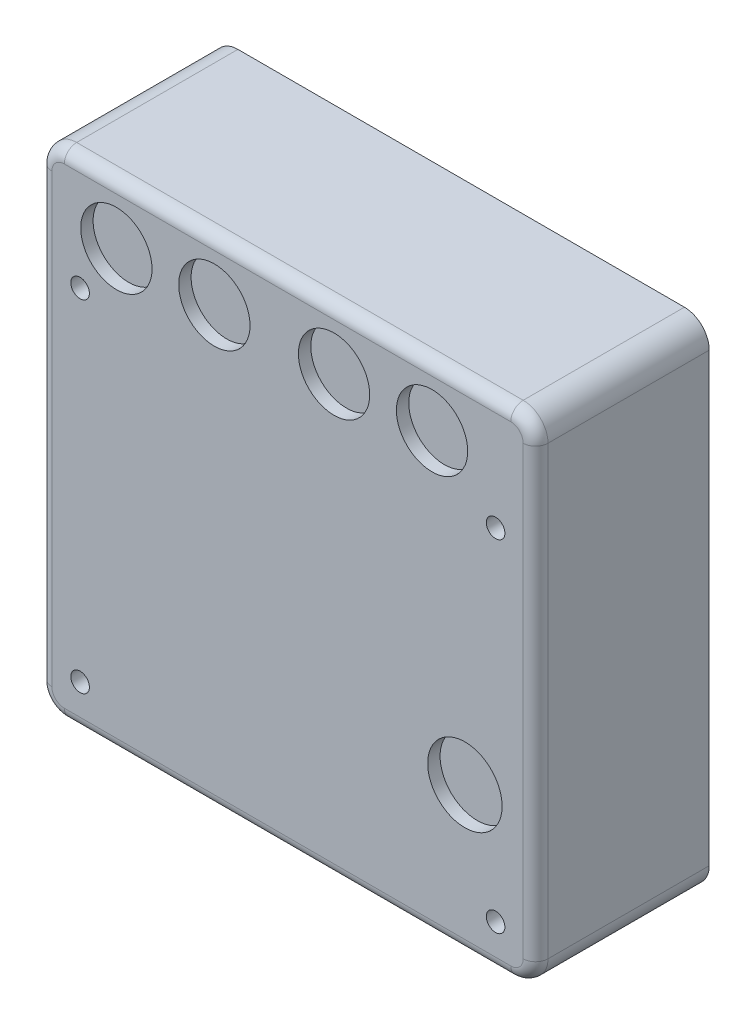
ISO-10303-21;
HEADER;
FILE_DESCRIPTION(('STEP AP214'),'2;1');
FILE_NAME('part.step','',(''),(''),'','','');
FILE_SCHEMA(('AUTOMOTIVE_DESIGN { 1 0 10303 214 1 1 1 1 }'));
ENDSEC;
DATA;
#1=APPLICATION_CONTEXT('core data for automotive mechanical design processes');
#2=APPLICATION_PROTOCOL_DEFINITION('international standard','automotive_design',2000,#1);
#3=PRODUCT_CONTEXT('',#1,'mechanical');
#4=PRODUCT('Part','Part','',(#3));
#5=PRODUCT_RELATED_PRODUCT_CATEGORY('part','',(#4));
#6=PRODUCT_DEFINITION_FORMATION('','',#4);
#7=PRODUCT_DEFINITION_CONTEXT('part definition',#1,'design');
#8=PRODUCT_DEFINITION('design','',#6,#7);
#9=PRODUCT_DEFINITION_SHAPE('','',#8);
#10=(LENGTH_UNIT() NAMED_UNIT(*) SI_UNIT(.MILLI.,.METRE.));
#11=(NAMED_UNIT(*) PLANE_ANGLE_UNIT() SI_UNIT($,.RADIAN.));
#12=(NAMED_UNIT(*) SI_UNIT($,.STERADIAN.) SOLID_ANGLE_UNIT());
#13=UNCERTAINTY_MEASURE_WITH_UNIT(LENGTH_MEASURE(1.E-05),#10,'distance_accuracy_value','');
#14=(GEOMETRIC_REPRESENTATION_CONTEXT(3) GLOBAL_UNCERTAINTY_ASSIGNED_CONTEXT((#13)) GLOBAL_UNIT_ASSIGNED_CONTEXT((#10,
#11,#12)) REPRESENTATION_CONTEXT('',''));
#15=CARTESIAN_POINT('',(0.,0.,0.));
#16=DIRECTION('',(0.,0.,1.));
#17=DIRECTION('',(1.,0.,0.));
#18=AXIS2_PLACEMENT_3D('',#15,#16,#17);
#19=CARTESIAN_POINT('',(0.,0.,-14.));
#20=DIRECTION('',(0.,0.,1.));
#21=DIRECTION('',(1.,0.,0.));
#22=AXIS2_PLACEMENT_3D('',#19,#20,#21);
#23=PLANE('',#22);
#24=DIRECTION('',(0.,1.,0.));
#25=VECTOR('',#24,1.);
#26=CARTESIAN_POINT('',(40.,40.,-14.));
#27=LINE('',#26,#25);
#28=CARTESIAN_POINT('',(40.,-36.,-14.));
#29=VERTEX_POINT('',#28);
#30=CARTESIAN_POINT('',(40.,36.,-14.));
#31=VERTEX_POINT('',#30);
#32=EDGE_CURVE('E257',#29,#31,#27,.T.);
#33=ORIENTED_EDGE('',*,*,#32,.F.);
#34=CARTESIAN_POINT('',(36.,-36.,-14.));
#35=DIRECTION('',(0.,0.,1.));
#36=DIRECTION('',(1.,0.,0.));
#37=AXIS2_PLACEMENT_3D('',#34,#35,#36);
#38=CIRCLE('',#37,4.);
#39=CARTESIAN_POINT('',(36.,-40.,-14.));
#40=VERTEX_POINT('',#39);
#41=EDGE_CURVE('E361',#29,#40,#38,.F.);
#42=ORIENTED_EDGE('',*,*,#41,.T.);
#43=DIRECTION('',(1.,0.,0.));
#44=VECTOR('',#43,1.);
#45=CARTESIAN_POINT('',(-40.,-40.,-14.));
#46=LINE('',#45,#44);
#47=CARTESIAN_POINT('',(-36.,-40.,-14.));
#48=VERTEX_POINT('',#47);
#49=EDGE_CURVE('E270',#48,#40,#46,.T.);
#50=ORIENTED_EDGE('',*,*,#49,.F.);
#51=CARTESIAN_POINT('',(-36.,-36.,-14.));
#52=DIRECTION('',(0.,0.,1.));
#53=DIRECTION('',(1.,0.,0.));
#54=AXIS2_PLACEMENT_3D('',#51,#52,#53);
#55=CIRCLE('',#54,4.);
#56=CARTESIAN_POINT('',(-40.,-36.,-14.));
#57=VERTEX_POINT('',#56);
#58=EDGE_CURVE('E358',#48,#57,#55,.F.);
#59=ORIENTED_EDGE('',*,*,#58,.T.);
#60=DIRECTION('',(0.,-1.,0.));
#61=VECTOR('',#60,1.);
#62=CARTESIAN_POINT('',(-40.,40.,-14.));
#63=LINE('',#62,#61);
#64=CARTESIAN_POINT('',(-40.,36.,-14.));
#65=VERTEX_POINT('',#64);
#66=EDGE_CURVE('E266',#65,#57,#63,.T.);
#67=ORIENTED_EDGE('',*,*,#66,.F.);
#68=CARTESIAN_POINT('',(-36.,36.,-14.));
#69=DIRECTION('',(0.,0.,1.));
#70=DIRECTION('',(1.,0.,0.));
#71=AXIS2_PLACEMENT_3D('',#68,#69,#70);
#72=CIRCLE('',#71,4.);
#73=CARTESIAN_POINT('',(-36.,40.,-14.));
#74=VERTEX_POINT('',#73);
#75=EDGE_CURVE('E352',#65,#74,#72,.F.);
#76=ORIENTED_EDGE('',*,*,#75,.T.);
#77=DIRECTION('',(-1.,0.,0.));
#78=VECTOR('',#77,1.);
#79=CARTESIAN_POINT('',(-40.,40.,-14.));
#80=LINE('',#79,#78);
#81=CARTESIAN_POINT('',(36.,40.,-14.));
#82=VERTEX_POINT('',#81);
#83=EDGE_CURVE('E261',#82,#74,#80,.T.);
#84=ORIENTED_EDGE('',*,*,#83,.F.);
#85=CARTESIAN_POINT('',(36.,36.,-14.));
#86=DIRECTION('',(0.,0.,1.));
#87=DIRECTION('',(1.,0.,0.));
#88=AXIS2_PLACEMENT_3D('',#85,#86,#87);
#89=CIRCLE('',#88,4.);
#90=EDGE_CURVE('E355',#82,#31,#89,.F.);
#91=ORIENTED_EDGE('',*,*,#90,.T.);
#92=EDGE_LOOP('',(#33,#42,#50,#59,#67,#76,#84,#91));
#93=FACE_BOUND('',#92,.T.);
#94=DIRECTION('',(0.,1.,0.));
#95=VECTOR('',#94,1.);
#96=CARTESIAN_POINT('',(-16.75,21.,-14.));
#97=LINE('',#96,#95);
#98=CARTESIAN_POINT('',(-16.75,-21.,-14.));
#99=VERTEX_POINT('',#98);
#100=CARTESIAN_POINT('',(-16.75,21.,-14.));
#101=VERTEX_POINT('',#100);
#102=EDGE_CURVE('E59',#99,#101,#97,.T.);
#103=ORIENTED_EDGE('',*,*,#102,.F.);
#104=DIRECTION('',(-1.,0.,0.));
#105=VECTOR('',#104,1.);
#106=CARTESIAN_POINT('',(16.75,-21.,-14.));
#107=LINE('',#106,#105);
#108=CARTESIAN_POINT('',(16.75,-21.,-14.));
#109=VERTEX_POINT('',#108);
#110=EDGE_CURVE('E63',#109,#99,#107,.T.);
#111=ORIENTED_EDGE('',*,*,#110,.F.);
#112=DIRECTION('',(0.,-1.,0.));
#113=VECTOR('',#112,1.);
#114=CARTESIAN_POINT('',(16.75,21.,-14.));
#115=LINE('',#114,#113);
#116=CARTESIAN_POINT('',(16.75,21.,-14.));
#117=VERTEX_POINT('',#116);
#118=EDGE_CURVE('E838',#117,#109,#115,.T.);
#119=ORIENTED_EDGE('',*,*,#118,.F.);
#120=DIRECTION('',(1.,0.,0.));
#121=VECTOR('',#120,1.);
#122=CARTESIAN_POINT('',(16.75,21.,-14.));
#123=LINE('',#122,#121);
#124=EDGE_CURVE('E848',#101,#117,#123,.T.);
#125=ORIENTED_EDGE('',*,*,#124,.F.);
#126=EDGE_LOOP('',(#103,#111,#119,#125));
#127=FACE_BOUND('',#126,.T.);
#128=ADVANCED_FACE('F41',(#93,#127),#23,.F.);
#129=CARTESIAN_POINT('',(0.,0.,14.));
#130=DIRECTION('',(0.,0.,1.));
#131=DIRECTION('',(1.,0.,0.));
#132=AXIS2_PLACEMENT_3D('',#129,#130,#131);
#133=PLANE('',#132);
#134=CARTESIAN_POINT('',(28.6,-16.4,14.));
#135=DIRECTION('',(0.,0.,1.));
#136=DIRECTION('',(1.,0.,0.));
#137=AXIS2_PLACEMENT_3D('',#134,#135,#136);
#138=CIRCLE('',#137,6.00000000000001);
#139=CARTESIAN_POINT('',(34.6,-16.4,14.));
#140=VERTEX_POINT('',#139);
#141=EDGE_CURVE('E179',#140,#140,#138,.T.);
#142=ORIENTED_EDGE('',*,*,#141,.F.);
#143=EDGE_LOOP('',(#142));
#144=FACE_BOUND('',#143,.T.);
#145=CARTESIAN_POINT('',(33.55,21.95,14.));
#146=DIRECTION('',(0.,0.,1.));
#147=DIRECTION('',(1.,0.,0.));
#148=AXIS2_PLACEMENT_3D('',#145,#146,#147);
#149=CIRCLE('',#148,1.5);
#150=CARTESIAN_POINT('',(35.05,21.95,14.));
#151=VERTEX_POINT('',#150);
#152=EDGE_CURVE('E207',#151,#151,#149,.T.);
#153=ORIENTED_EDGE('',*,*,#152,.F.);
#154=EDGE_LOOP('',(#153));
#155=FACE_BOUND('',#154,.T.);
#156=CARTESIAN_POINT('',(-33.45,-33.05,14.));
#157=DIRECTION('',(0.,0.,1.));
#158=DIRECTION('',(1.,0.,0.));
#159=AXIS2_PLACEMENT_3D('',#156,#157,#158);
#160=CIRCLE('',#159,1.5);
#161=CARTESIAN_POINT('',(-31.95,-33.05,14.));
#162=VERTEX_POINT('',#161);
#163=EDGE_CURVE('E198',#162,#162,#160,.T.);
#164=ORIENTED_EDGE('',*,*,#163,.F.);
#165=EDGE_LOOP('',(#164));
#166=FACE_BOUND('',#165,.T.);
#167=CARTESIAN_POINT('',(33.55,-33.05,14.));
#168=DIRECTION('',(0.,0.,1.));
#169=DIRECTION('',(1.,0.,0.));
#170=AXIS2_PLACEMENT_3D('',#167,#168,#169);
#171=CIRCLE('',#170,1.5);
#172=CARTESIAN_POINT('',(35.05,-33.05,14.));
#173=VERTEX_POINT('',#172);
#174=EDGE_CURVE('E192',#173,#173,#171,.T.);
#175=ORIENTED_EDGE('',*,*,#174,.F.);
#176=EDGE_LOOP('',(#175));
#177=FACE_BOUND('',#176,.T.);
#178=CARTESIAN_POINT('',(-33.45,21.95,14.));
#179=DIRECTION('',(0.,0.,1.));
#180=DIRECTION('',(1.,0.,0.));
#181=AXIS2_PLACEMENT_3D('',#178,#179,#180);
#182=CIRCLE('',#181,1.5);
#183=CARTESIAN_POINT('',(-31.95,21.95,14.));
#184=VERTEX_POINT('',#183);
#185=EDGE_CURVE('E206',#184,#184,#182,.T.);
#186=ORIENTED_EDGE('',*,*,#185,.F.);
#187=EDGE_LOOP('',(#186));
#188=FACE_BOUND('',#187,.T.);
#189=CARTESIAN_POINT('',(-27.6,30.4,14.));
#190=DIRECTION('',(0.,0.,1.));
#191=DIRECTION('',(1.,0.,0.));
#192=AXIS2_PLACEMENT_3D('',#189,#190,#191);
#193=CIRCLE('',#192,5.75);
#194=CARTESIAN_POINT('',(-21.85,30.4,14.));
#195=VERTEX_POINT('',#194);
#196=EDGE_CURVE('E230',#195,#195,#193,.T.);
#197=ORIENTED_EDGE('',*,*,#196,.F.);
#198=EDGE_LOOP('',(#197));
#199=FACE_BOUND('',#198,.T.);
#200=CARTESIAN_POINT('',(-11.8,30.4,14.));
#201=DIRECTION('',(0.,0.,1.));
#202=DIRECTION('',(1.,0.,0.));
#203=AXIS2_PLACEMENT_3D('',#200,#201,#202);
#204=CIRCLE('',#203,5.75);
#205=CARTESIAN_POINT('',(-6.05000000000002,30.4,14.));
#206=VERTEX_POINT('',#205);
#207=EDGE_CURVE('E238',#206,#206,#204,.T.);
#208=ORIENTED_EDGE('',*,*,#207,.F.);
#209=EDGE_LOOP('',(#208));
#210=FACE_BOUND('',#209,.T.);
#211=CARTESIAN_POINT('',(7.49999999999998,30.4,14.));
#212=DIRECTION('',(0.,0.,1.));
#213=DIRECTION('',(1.,0.,0.));
#214=AXIS2_PLACEMENT_3D('',#211,#212,#213);
#215=CIRCLE('',#214,5.75);
#216=CARTESIAN_POINT('',(13.25,30.4,14.));
#217=VERTEX_POINT('',#216);
#218=EDGE_CURVE('E246',#217,#217,#215,.T.);
#219=ORIENTED_EDGE('',*,*,#218,.F.);
#220=EDGE_LOOP('',(#219));
#221=FACE_BOUND('',#220,.T.);
#222=CARTESIAN_POINT('',(23.3,30.4,14.));
#223=DIRECTION('',(0.,0.,1.));
#224=DIRECTION('',(1.,0.,0.));
#225=AXIS2_PLACEMENT_3D('',#222,#223,#224);
#226=CIRCLE('',#225,5.75);
#227=CARTESIAN_POINT('',(29.05,30.4,14.));
#228=VERTEX_POINT('',#227);
#229=EDGE_CURVE('E222',#228,#228,#226,.T.);
#230=ORIENTED_EDGE('',*,*,#229,.F.);
#231=EDGE_LOOP('',(#230));
#232=FACE_BOUND('',#231,.T.);
#233=CARTESIAN_POINT('',(-36.,36.,14.));
#234=DIRECTION('',(0.,0.,1.));
#235=DIRECTION('',(1.,0.,0.));
#236=AXIS2_PLACEMENT_3D('',#233,#234,#235);
#237=CIRCLE('',#236,2.);
#238=CARTESIAN_POINT('',(-38.,36.,14.));
#239=VERTEX_POINT('',#238);
#240=CARTESIAN_POINT('',(-36.,38.,14.));
#241=VERTEX_POINT('',#240);
#242=EDGE_CURVE('E316',#239,#241,#237,.F.);
#243=ORIENTED_EDGE('',*,*,#242,.F.);
#244=DIRECTION('',(0.,-1.,0.));
#245=VECTOR('',#244,1.);
#246=CARTESIAN_POINT('',(-38.,-40.,14.));
#247=LINE('',#246,#245);
#248=CARTESIAN_POINT('',(-38.,-36.,14.));
#249=VERTEX_POINT('',#248);
#250=EDGE_CURVE('E278',#239,#249,#247,.T.);
#251=ORIENTED_EDGE('',*,*,#250,.T.);
#252=CARTESIAN_POINT('',(-36.,-36.,14.));
#253=DIRECTION('',(0.,0.,1.));
#254=DIRECTION('',(1.,0.,0.));
#255=AXIS2_PLACEMENT_3D('',#252,#253,#254);
#256=CIRCLE('',#255,2.);
#257=CARTESIAN_POINT('',(-36.,-38.,14.));
#258=VERTEX_POINT('',#257);
#259=EDGE_CURVE('E309',#258,#249,#256,.F.);
#260=ORIENTED_EDGE('',*,*,#259,.F.);
#261=DIRECTION('',(1.,0.,0.));
#262=VECTOR('',#261,1.);
#263=CARTESIAN_POINT('',(40.,-38.,14.));
#264=LINE('',#263,#262);
#265=CARTESIAN_POINT('',(36.,-38.,14.));
#266=VERTEX_POINT('',#265);
#267=EDGE_CURVE('E282',#258,#266,#264,.T.);
#268=ORIENTED_EDGE('',*,*,#267,.T.);
#269=CARTESIAN_POINT('',(36.,-36.,14.));
#270=DIRECTION('',(0.,0.,1.));
#271=DIRECTION('',(1.,0.,0.));
#272=AXIS2_PLACEMENT_3D('',#269,#270,#271);
#273=CIRCLE('',#272,2.);
#274=CARTESIAN_POINT('',(38.,-36.,14.));
#275=VERTEX_POINT('',#274);
#276=EDGE_CURVE('E306',#275,#266,#273,.F.);
#277=ORIENTED_EDGE('',*,*,#276,.F.);
#278=DIRECTION('',(0.,1.,0.));
#279=VECTOR('',#278,1.);
#280=CARTESIAN_POINT('',(38.,40.,14.));
#281=LINE('',#280,#279);
#282=CARTESIAN_POINT('',(38.,36.,14.));
#283=VERTEX_POINT('',#282);
#284=EDGE_CURVE('E286',#275,#283,#281,.T.);
#285=ORIENTED_EDGE('',*,*,#284,.T.);
#286=CARTESIAN_POINT('',(36.,36.,14.));
#287=DIRECTION('',(0.,0.,1.));
#288=DIRECTION('',(1.,0.,0.));
#289=AXIS2_PLACEMENT_3D('',#286,#287,#288);
#290=CIRCLE('',#289,2.);
#291=CARTESIAN_POINT('',(36.,38.,14.));
#292=VERTEX_POINT('',#291);
#293=EDGE_CURVE('E312',#292,#283,#290,.F.);
#294=ORIENTED_EDGE('',*,*,#293,.F.);
#295=DIRECTION('',(-1.,0.,0.));
#296=VECTOR('',#295,1.);
#297=CARTESIAN_POINT('',(-40.,38.,14.));
#298=LINE('',#297,#296);
#299=EDGE_CURVE('E274',#292,#241,#298,.T.);
#300=ORIENTED_EDGE('',*,*,#299,.T.);
#301=EDGE_LOOP('',(#243,#251,#260,#268,#277,#285,#294,#300));
#302=FACE_BOUND('',#301,.T.);
#303=ADVANCED_FACE('F422',(#144,#155,#166,#177,#188,#199,#210,#221,#232,#302),#133,.T.);
#304=CARTESIAN_POINT('',(40.,40.,14.));
#305=DIRECTION('',(-1.,0.,0.));
#306=DIRECTION('',(0.,-1.,0.));
#307=AXIS2_PLACEMENT_3D('',#304,#305,#306);
#308=PLANE('',#307);
#309=DIRECTION('',(0.,1.,0.));
#310=VECTOR('',#309,1.);
#311=CARTESIAN_POINT('',(40.,-40.,12.));
#312=LINE('',#311,#310);
#313=CARTESIAN_POINT('',(40.,36.,12.));
#314=VERTEX_POINT('',#313);
#315=CARTESIAN_POINT('',(40.,-36.,12.));
#316=VERTEX_POINT('',#315);
#317=EDGE_CURVE('E290',#314,#316,#312,.F.);
#318=ORIENTED_EDGE('',*,*,#317,.T.);
#319=DIRECTION('',(0.,0.,-1.));
#320=VECTOR('',#319,1.);
#321=CARTESIAN_POINT('',(40.,-36.,14.));
#322=LINE('',#321,#320);
#323=EDGE_CURVE('E349',#316,#29,#322,.T.);
#324=ORIENTED_EDGE('',*,*,#323,.T.);
#325=ORIENTED_EDGE('',*,*,#32,.T.);
#326=DIRECTION('',(0.,0.,-1.));
#327=VECTOR('',#326,1.);
#328=CARTESIAN_POINT('',(40.,36.,14.));
#329=LINE('',#328,#327);
#330=EDGE_CURVE('E346',#31,#314,#329,.F.);
#331=ORIENTED_EDGE('',*,*,#330,.T.);
#332=EDGE_LOOP('',(#318,#324,#325,#331));
#333=FACE_BOUND('',#332,.T.);
#334=ADVANCED_FACE('F404',(#333),#308,.F.);
#335=CARTESIAN_POINT('',(-40.,40.,14.));
#336=DIRECTION('',(0.,-1.,0.));
#337=DIRECTION('',(0.,0.,-1.));
#338=AXIS2_PLACEMENT_3D('',#335,#336,#337);
#339=PLANE('',#338);
#340=DIRECTION('',(-1.,0.,0.));
#341=VECTOR('',#340,1.);
#342=CARTESIAN_POINT('',(40.,40.,12.));
#343=LINE('',#342,#341);
#344=CARTESIAN_POINT('',(-36.,40.,12.));
#345=VERTEX_POINT('',#344);
#346=CARTESIAN_POINT('',(36.,40.,12.));
#347=VERTEX_POINT('',#346);
#348=EDGE_CURVE('E302',#345,#347,#343,.F.);
#349=ORIENTED_EDGE('',*,*,#348,.T.);
#350=DIRECTION('',(0.,0.,-1.));
#351=VECTOR('',#350,1.);
#352=CARTESIAN_POINT('',(36.,40.,14.));
#353=LINE('',#352,#351);
#354=EDGE_CURVE('E11',#347,#82,#353,.T.);
#355=ORIENTED_EDGE('',*,*,#354,.T.);
#356=ORIENTED_EDGE('',*,*,#83,.T.);
#357=DIRECTION('',(0.,0.,-1.));
#358=VECTOR('',#357,1.);
#359=CARTESIAN_POINT('',(-36.,40.,14.));
#360=LINE('',#359,#358);
#361=EDGE_CURVE('E51',#74,#345,#360,.F.);
#362=ORIENTED_EDGE('',*,*,#361,.T.);
#363=EDGE_LOOP('',(#349,#355,#356,#362));
#364=FACE_BOUND('',#363,.T.);
#365=ADVANCED_FACE('F431',(#364),#339,.F.);
#366=CARTESIAN_POINT('',(-40.,40.,14.));
#367=DIRECTION('',(1.,0.,0.));
#368=DIRECTION('',(0.,0.,-1.));
#369=AXIS2_PLACEMENT_3D('',#366,#367,#368);
#370=PLANE('',#369);
#371=ORIENTED_EDGE('',*,*,#66,.T.);
#372=DIRECTION('',(0.,0.,-1.));
#373=VECTOR('',#372,1.);
#374=CARTESIAN_POINT('',(-40.,-36.,14.));
#375=LINE('',#374,#373);
#376=CARTESIAN_POINT('',(-40.,-36.,12.));
#377=VERTEX_POINT('',#376);
#378=EDGE_CURVE('E373',#57,#377,#375,.F.);
#379=ORIENTED_EDGE('',*,*,#378,.T.);
#380=DIRECTION('',(0.,-1.,0.));
#381=VECTOR('',#380,1.);
#382=CARTESIAN_POINT('',(-40.,40.,12.));
#383=LINE('',#382,#381);
#384=CARTESIAN_POINT('',(-40.,36.,12.));
#385=VERTEX_POINT('',#384);
#386=EDGE_CURVE('E298',#377,#385,#383,.F.);
#387=ORIENTED_EDGE('',*,*,#386,.T.);
#388=DIRECTION('',(0.,0.,-1.));
#389=VECTOR('',#388,1.);
#390=CARTESIAN_POINT('',(-40.,36.,14.));
#391=LINE('',#390,#389);
#392=EDGE_CURVE('E370',#385,#65,#391,.T.);
#393=ORIENTED_EDGE('',*,*,#392,.T.);
#394=EDGE_LOOP('',(#371,#379,#387,#393));
#395=FACE_BOUND('',#394,.T.);
#396=ADVANCED_FACE('F458',(#395),#370,.F.);
#397=CARTESIAN_POINT('',(-40.,-40.,14.));
#398=DIRECTION('',(0.,1.,0.));
#399=DIRECTION('',(0.,0.,1.));
#400=AXIS2_PLACEMENT_3D('',#397,#398,#399);
#401=PLANE('',#400);
#402=ORIENTED_EDGE('',*,*,#49,.T.);
#403=DIRECTION('',(0.,0.,-1.));
#404=VECTOR('',#403,1.);
#405=CARTESIAN_POINT('',(36.,-40.,14.));
#406=LINE('',#405,#404);
#407=CARTESIAN_POINT('',(36.,-40.,12.));
#408=VERTEX_POINT('',#407);
#409=EDGE_CURVE('E367',#40,#408,#406,.F.);
#410=ORIENTED_EDGE('',*,*,#409,.T.);
#411=DIRECTION('',(1.,0.,0.));
#412=VECTOR('',#411,1.);
#413=CARTESIAN_POINT('',(-40.,-40.,12.));
#414=LINE('',#413,#412);
#415=CARTESIAN_POINT('',(-36.,-40.,12.));
#416=VERTEX_POINT('',#415);
#417=EDGE_CURVE('E294',#408,#416,#414,.F.);
#418=ORIENTED_EDGE('',*,*,#417,.T.);
#419=DIRECTION('',(0.,0.,-1.));
#420=VECTOR('',#419,1.);
#421=CARTESIAN_POINT('',(-36.,-40.,14.));
#422=LINE('',#421,#420);
#423=EDGE_CURVE('E364',#416,#48,#422,.T.);
#424=ORIENTED_EDGE('',*,*,#423,.T.);
#425=EDGE_LOOP('',(#402,#410,#418,#424));
#426=FACE_BOUND('',#425,.T.);
#427=ADVANCED_FACE('F451',(#426),#401,.F.);
#428=CARTESIAN_POINT('',(-38.,0.,12.));
#429=DIRECTION('',(0.,1.,0.));
#430=DIRECTION('',(0.,0.,1.));
#431=AXIS2_PLACEMENT_3D('',#428,#429,#430);
#432=CYLINDRICAL_SURFACE('',#431,2.);
#433=ORIENTED_EDGE('',*,*,#386,.F.);
#434=CARTESIAN_POINT('',(-38.,-36.,12.));
#435=DIRECTION('',(0.,1.,0.));
#436=DIRECTION('',(0.,0.,1.));
#437=AXIS2_PLACEMENT_3D('',#434,#435,#436);
#438=CIRCLE('',#437,2.);
#439=EDGE_CURVE('E335',#377,#249,#438,.T.);
#440=ORIENTED_EDGE('',*,*,#439,.T.);
#441=ORIENTED_EDGE('',*,*,#250,.F.);
#442=CARTESIAN_POINT('',(-38.,36.,12.));
#443=DIRECTION('',(0.,-1.,0.));
#444=DIRECTION('',(0.,0.,-1.));
#445=AXIS2_PLACEMENT_3D('',#442,#443,#444);
#446=CIRCLE('',#445,2.);
#447=EDGE_CURVE('E332',#239,#385,#446,.T.);
#448=ORIENTED_EDGE('',*,*,#447,.T.);
#449=EDGE_LOOP('',(#433,#440,#441,#448));
#450=FACE_BOUND('',#449,.T.);
#451=ADVANCED_FACE('F443',(#450),#432,.T.);
#452=CARTESIAN_POINT('',(0.,-38.,12.));
#453=DIRECTION('',(-1.,0.,0.));
#454=DIRECTION('',(0.,0.,1.));
#455=AXIS2_PLACEMENT_3D('',#452,#453,#454);
#456=CYLINDRICAL_SURFACE('',#455,2.);
#457=ORIENTED_EDGE('',*,*,#417,.F.);
#458=CARTESIAN_POINT('',(36.,-38.,12.));
#459=DIRECTION('',(-1.,0.,0.));
#460=DIRECTION('',(0.,0.,1.));
#461=AXIS2_PLACEMENT_3D('',#458,#459,#460);
#462=CIRCLE('',#461,2.);
#463=EDGE_CURVE('E342',#408,#266,#462,.T.);
#464=ORIENTED_EDGE('',*,*,#463,.T.);
#465=ORIENTED_EDGE('',*,*,#267,.F.);
#466=CARTESIAN_POINT('',(-36.,-38.,12.));
#467=DIRECTION('',(1.,0.,0.));
#468=DIRECTION('',(0.,0.,-1.));
#469=AXIS2_PLACEMENT_3D('',#466,#467,#468);
#470=CIRCLE('',#469,2.);
#471=EDGE_CURVE('E339',#258,#416,#470,.T.);
#472=ORIENTED_EDGE('',*,*,#471,.T.);
#473=EDGE_LOOP('',(#457,#464,#465,#472));
#474=FACE_BOUND('',#473,.T.);
#475=ADVANCED_FACE('F448',(#474),#456,.T.);
#476=CARTESIAN_POINT('',(0.,38.,12.));
#477=DIRECTION('',(1.,0.,0.));
#478=DIRECTION('',(0.,0.,-1.));
#479=AXIS2_PLACEMENT_3D('',#476,#477,#478);
#480=CYLINDRICAL_SURFACE('',#479,2.);
#481=ORIENTED_EDGE('',*,*,#348,.F.);
#482=CARTESIAN_POINT('',(-36.,38.,12.));
#483=DIRECTION('',(1.,0.,0.));
#484=DIRECTION('',(0.,0.,-1.));
#485=AXIS2_PLACEMENT_3D('',#482,#483,#484);
#486=CIRCLE('',#485,2.);
#487=EDGE_CURVE('E323',#345,#241,#486,.T.);
#488=ORIENTED_EDGE('',*,*,#487,.T.);
#489=ORIENTED_EDGE('',*,*,#299,.F.);
#490=CARTESIAN_POINT('',(36.,38.,12.));
#491=DIRECTION('',(-1.,0.,0.));
#492=DIRECTION('',(0.,0.,1.));
#493=AXIS2_PLACEMENT_3D('',#490,#491,#492);
#494=CIRCLE('',#493,2.);
#495=EDGE_CURVE('E320',#292,#347,#494,.T.);
#496=ORIENTED_EDGE('',*,*,#495,.T.);
#497=EDGE_LOOP('',(#481,#488,#489,#496));
#498=FACE_BOUND('',#497,.T.);
#499=ADVANCED_FACE('F428',(#498),#480,.T.);
#500=CARTESIAN_POINT('',(38.,0.,12.));
#501=DIRECTION('',(0.,-1.,0.));
#502=DIRECTION('',(1.,0.,0.));
#503=AXIS2_PLACEMENT_3D('',#500,#501,#502);
#504=CYLINDRICAL_SURFACE('',#503,2.);
#505=ORIENTED_EDGE('',*,*,#317,.F.);
#506=CARTESIAN_POINT('',(38.,36.,12.));
#507=DIRECTION('',(0.,-1.,0.));
#508=DIRECTION('',(0.,0.,-1.));
#509=AXIS2_PLACEMENT_3D('',#506,#507,#508);
#510=CIRCLE('',#509,2.);
#511=EDGE_CURVE('E329',#314,#283,#510,.T.);
#512=ORIENTED_EDGE('',*,*,#511,.T.);
#513=ORIENTED_EDGE('',*,*,#284,.F.);
#514=CARTESIAN_POINT('',(38.,-36.,12.));
#515=DIRECTION('',(0.,1.,0.));
#516=DIRECTION('',(0.,0.,1.));
#517=AXIS2_PLACEMENT_3D('',#514,#515,#516);
#518=CIRCLE('',#517,2.);
#519=EDGE_CURVE('E326',#275,#316,#518,.T.);
#520=ORIENTED_EDGE('',*,*,#519,.T.);
#521=EDGE_LOOP('',(#505,#512,#513,#520));
#522=FACE_BOUND('',#521,.T.);
#523=ADVANCED_FACE('F417',(#522),#504,.T.);
#524=CARTESIAN_POINT('',(-36.,36.,14.));
#525=DIRECTION('',(0.,0.,-1.));
#526=DIRECTION('',(-1.,0.,0.));
#527=AXIS2_PLACEMENT_3D('',#524,#525,#526);
#528=CYLINDRICAL_SURFACE('',#527,4.);
#529=ORIENTED_EDGE('',*,*,#75,.F.);
#530=ORIENTED_EDGE('',*,*,#392,.F.);
#531=CARTESIAN_POINT('',(-36.,36.,12.));
#532=DIRECTION('',(0.,0.,1.));
#533=DIRECTION('',(1.,0.,0.));
#534=AXIS2_PLACEMENT_3D('',#531,#532,#533);
#535=CIRCLE('',#534,4.);
#536=EDGE_CURVE('E262',#345,#385,#535,.T.);
#537=ORIENTED_EDGE('',*,*,#536,.F.);
#538=ORIENTED_EDGE('',*,*,#361,.F.);
#539=EDGE_LOOP('',(#529,#530,#537,#538));
#540=FACE_BOUND('',#539,.T.);
#541=ADVANCED_FACE('F435',(#540),#528,.T.);
#542=CARTESIAN_POINT('',(-36.,36.,12.));
#543=DIRECTION('',(0.,0.,1.));
#544=DIRECTION('',(1.,0.,0.));
#545=AXIS2_PLACEMENT_3D('',#542,#543,#544);
#546=DEGENERATE_TOROIDAL_SURFACE('',#545,2.,2.,.T.);
#547=ORIENTED_EDGE('',*,*,#447,.F.);
#548=ORIENTED_EDGE('',*,*,#242,.T.);
#549=ORIENTED_EDGE('',*,*,#487,.F.);
#550=ORIENTED_EDGE('',*,*,#536,.T.);
#551=EDGE_LOOP('',(#547,#548,#549,#550));
#552=FACE_BOUND('',#551,.T.);
#553=ADVANCED_FACE('F439',(#552),#546,.T.);
#554=CARTESIAN_POINT('',(36.,36.,14.));
#555=DIRECTION('',(0.,0.,-1.));
#556=DIRECTION('',(-1.,0.,0.));
#557=AXIS2_PLACEMENT_3D('',#554,#555,#556);
#558=CYLINDRICAL_SURFACE('',#557,4.);
#559=ORIENTED_EDGE('',*,*,#90,.F.);
#560=ORIENTED_EDGE('',*,*,#354,.F.);
#561=CARTESIAN_POINT('',(36.,36.,12.));
#562=DIRECTION('',(0.,0.,1.));
#563=DIRECTION('',(1.,0.,0.));
#564=AXIS2_PLACEMENT_3D('',#561,#562,#563);
#565=CIRCLE('',#564,4.);
#566=EDGE_CURVE('E381',#314,#347,#565,.T.);
#567=ORIENTED_EDGE('',*,*,#566,.F.);
#568=ORIENTED_EDGE('',*,*,#330,.F.);
#569=EDGE_LOOP('',(#559,#560,#567,#568));
#570=FACE_BOUND('',#569,.T.);
#571=ADVANCED_FACE('F413',(#570),#558,.T.);
#572=CARTESIAN_POINT('',(36.,36.,12.));
#573=DIRECTION('',(0.,0.,1.));
#574=DIRECTION('',(1.,0.,0.));
#575=AXIS2_PLACEMENT_3D('',#572,#573,#574);
#576=DEGENERATE_TOROIDAL_SURFACE('',#575,2.,2.,.T.);
#577=ORIENTED_EDGE('',*,*,#495,.F.);
#578=ORIENTED_EDGE('',*,*,#293,.T.);
#579=ORIENTED_EDGE('',*,*,#511,.F.);
#580=ORIENTED_EDGE('',*,*,#566,.T.);
#581=EDGE_LOOP('',(#577,#578,#579,#580));
#582=FACE_BOUND('',#581,.T.);
#583=ADVANCED_FACE('F425',(#582),#576,.T.);
#584=CARTESIAN_POINT('',(-36.,-36.,14.));
#585=DIRECTION('',(0.,0.,-1.));
#586=DIRECTION('',(-1.,0.,0.));
#587=AXIS2_PLACEMENT_3D('',#584,#585,#586);
#588=CYLINDRICAL_SURFACE('',#587,4.);
#589=ORIENTED_EDGE('',*,*,#58,.F.);
#590=ORIENTED_EDGE('',*,*,#423,.F.);
#591=CARTESIAN_POINT('',(-36.,-36.,12.));
#592=DIRECTION('',(0.,0.,1.));
#593=DIRECTION('',(1.,0.,0.));
#594=AXIS2_PLACEMENT_3D('',#591,#592,#593);
#595=CIRCLE('',#594,4.);
#596=EDGE_CURVE('E384',#377,#416,#595,.T.);
#597=ORIENTED_EDGE('',*,*,#596,.F.);
#598=ORIENTED_EDGE('',*,*,#378,.F.);
#599=EDGE_LOOP('',(#589,#590,#597,#598));
#600=FACE_BOUND('',#599,.T.);
#601=ADVANCED_FACE('F454',(#600),#588,.T.);
#602=CARTESIAN_POINT('',(-36.,-36.,12.));
#603=DIRECTION('',(0.,0.,1.));
#604=DIRECTION('',(1.,0.,0.));
#605=AXIS2_PLACEMENT_3D('',#602,#603,#604);
#606=DEGENERATE_TOROIDAL_SURFACE('',#605,2.,2.,.T.);
#607=ORIENTED_EDGE('',*,*,#439,.F.);
#608=ORIENTED_EDGE('',*,*,#596,.T.);
#609=ORIENTED_EDGE('',*,*,#471,.F.);
#610=ORIENTED_EDGE('',*,*,#259,.T.);
#611=EDGE_LOOP('',(#607,#608,#609,#610));
#612=FACE_BOUND('',#611,.T.);
#613=ADVANCED_FACE('F444',(#612),#606,.T.);
#614=CARTESIAN_POINT('',(36.,-36.,14.));
#615=DIRECTION('',(0.,0.,-1.));
#616=DIRECTION('',(-1.,0.,0.));
#617=AXIS2_PLACEMENT_3D('',#614,#615,#616);
#618=CYLINDRICAL_SURFACE('',#617,4.);
#619=ORIENTED_EDGE('',*,*,#41,.F.);
#620=ORIENTED_EDGE('',*,*,#323,.F.);
#621=CARTESIAN_POINT('',(36.,-36.,12.));
#622=DIRECTION('',(0.,0.,1.));
#623=DIRECTION('',(1.,0.,0.));
#624=AXIS2_PLACEMENT_3D('',#621,#622,#623);
#625=CIRCLE('',#624,4.);
#626=EDGE_CURVE('E45',#408,#316,#625,.T.);
#627=ORIENTED_EDGE('',*,*,#626,.F.);
#628=ORIENTED_EDGE('',*,*,#409,.F.);
#629=EDGE_LOOP('',(#619,#620,#627,#628));
#630=FACE_BOUND('',#629,.T.);
#631=ADVANCED_FACE('F43',(#630),#618,.T.);
#632=CARTESIAN_POINT('',(36.,-36.,12.));
#633=DIRECTION('',(0.,0.,1.));
#634=DIRECTION('',(1.,0.,0.));
#635=AXIS2_PLACEMENT_3D('',#632,#633,#634);
#636=DEGENERATE_TOROIDAL_SURFACE('',#635,2.,2.,.T.);
#637=ORIENTED_EDGE('',*,*,#463,.F.);
#638=ORIENTED_EDGE('',*,*,#626,.T.);
#639=ORIENTED_EDGE('',*,*,#519,.F.);
#640=ORIENTED_EDGE('',*,*,#276,.T.);
#641=EDGE_LOOP('',(#637,#638,#639,#640));
#642=FACE_BOUND('',#641,.T.);
#643=ADVANCED_FACE('F397',(#642),#636,.T.);
#644=CARTESIAN_POINT('',(23.3,30.4,12.));
#645=DIRECTION('',(0.,0.,1.));
#646=DIRECTION('',(1.,0.,0.));
#647=AXIS2_PLACEMENT_3D('',#644,#645,#646);
#648=CYLINDRICAL_SURFACE('',#647,5.75);
#649=CARTESIAN_POINT('',(23.3,30.4,12.));
#650=DIRECTION('',(0.,0.,1.));
#651=DIRECTION('',(1.,0.,0.));
#652=AXIS2_PLACEMENT_3D('',#649,#650,#651);
#653=CIRCLE('',#652,5.75);
#654=CARTESIAN_POINT('',(29.05,30.4,12.));
#655=VERTEX_POINT('',#654);
#656=EDGE_CURVE('E250',#655,#655,#653,.T.);
#657=ORIENTED_EDGE('',*,*,#656,.F.);
#658=EDGE_LOOP('',(#657));
#659=FACE_BOUND('',#658,.T.);
#660=ORIENTED_EDGE('',*,*,#229,.T.);
#661=EDGE_LOOP('',(#660));
#662=FACE_BOUND('',#661,.T.);
#663=ADVANCED_FACE('F475',(#659,#662),#648,.F.);
#664=CARTESIAN_POINT('',(23.3,30.4,12.));
#665=DIRECTION('',(0.,0.,1.));
#666=DIRECTION('',(1.,0.,0.));
#667=AXIS2_PLACEMENT_3D('',#664,#665,#666);
#668=PLANE('',#667);
#669=ORIENTED_EDGE('',*,*,#656,.T.);
#670=EDGE_LOOP('',(#669));
#671=FACE_BOUND('',#670,.T.);
#672=ADVANCED_FACE('F478',(#671),#668,.T.);
#673=CARTESIAN_POINT('',(7.49999999999998,30.4,12.));
#674=DIRECTION('',(0.,0.,1.));
#675=DIRECTION('',(1.,0.,0.));
#676=AXIS2_PLACEMENT_3D('',#673,#674,#675);
#677=CYLINDRICAL_SURFACE('',#676,5.75);
#678=CARTESIAN_POINT('',(7.49999999999998,30.4,12.));
#679=DIRECTION('',(0.,0.,1.));
#680=DIRECTION('',(1.,0.,0.));
#681=AXIS2_PLACEMENT_3D('',#678,#679,#680);
#682=CIRCLE('',#681,5.75);
#683=CARTESIAN_POINT('',(13.25,30.4,12.));
#684=VERTEX_POINT('',#683);
#685=EDGE_CURVE('E242',#684,#684,#682,.T.);
#686=ORIENTED_EDGE('',*,*,#685,.F.);
#687=EDGE_LOOP('',(#686));
#688=FACE_BOUND('',#687,.T.);
#689=ORIENTED_EDGE('',*,*,#218,.T.);
#690=EDGE_LOOP('',(#689));
#691=FACE_BOUND('',#690,.T.);
#692=ADVANCED_FACE('F482',(#688,#691),#677,.F.);
#693=CARTESIAN_POINT('',(7.49999999999998,30.4,12.));
#694=DIRECTION('',(0.,0.,1.));
#695=DIRECTION('',(1.,0.,0.));
#696=AXIS2_PLACEMENT_3D('',#693,#694,#695);
#697=PLANE('',#696);
#698=ORIENTED_EDGE('',*,*,#685,.T.);
#699=EDGE_LOOP('',(#698));
#700=FACE_BOUND('',#699,.T.);
#701=ADVANCED_FACE('F486',(#700),#697,.T.);
#702=CARTESIAN_POINT('',(-11.8,30.4,12.));
#703=DIRECTION('',(0.,0.,1.));
#704=DIRECTION('',(1.,0.,0.));
#705=AXIS2_PLACEMENT_3D('',#702,#703,#704);
#706=CYLINDRICAL_SURFACE('',#705,5.75);
#707=CARTESIAN_POINT('',(-11.8,30.4,12.));
#708=DIRECTION('',(0.,0.,1.));
#709=DIRECTION('',(1.,0.,0.));
#710=AXIS2_PLACEMENT_3D('',#707,#708,#709);
#711=CIRCLE('',#710,5.75);
#712=CARTESIAN_POINT('',(-6.05000000000002,30.4,12.));
#713=VERTEX_POINT('',#712);
#714=EDGE_CURVE('E234',#713,#713,#711,.T.);
#715=ORIENTED_EDGE('',*,*,#714,.F.);
#716=EDGE_LOOP('',(#715));
#717=FACE_BOUND('',#716,.T.);
#718=ORIENTED_EDGE('',*,*,#207,.T.);
#719=EDGE_LOOP('',(#718));
#720=FACE_BOUND('',#719,.T.);
#721=ADVANCED_FACE('F490',(#717,#720),#706,.F.);
#722=CARTESIAN_POINT('',(-11.8,30.4,12.));
#723=DIRECTION('',(0.,0.,1.));
#724=DIRECTION('',(1.,0.,0.));
#725=AXIS2_PLACEMENT_3D('',#722,#723,#724);
#726=PLANE('',#725);
#727=ORIENTED_EDGE('',*,*,#714,.T.);
#728=EDGE_LOOP('',(#727));
#729=FACE_BOUND('',#728,.T.);
#730=ADVANCED_FACE('F494',(#729),#726,.T.);
#731=CARTESIAN_POINT('',(-27.6,30.4,12.));
#732=DIRECTION('',(0.,0.,1.));
#733=DIRECTION('',(1.,0.,0.));
#734=AXIS2_PLACEMENT_3D('',#731,#732,#733);
#735=CYLINDRICAL_SURFACE('',#734,5.75);
#736=CARTESIAN_POINT('',(-27.6,30.4,12.));
#737=DIRECTION('',(0.,0.,1.));
#738=DIRECTION('',(1.,0.,0.));
#739=AXIS2_PLACEMENT_3D('',#736,#737,#738);
#740=CIRCLE('',#739,5.75);
#741=CARTESIAN_POINT('',(-21.85,30.4,12.));
#742=VERTEX_POINT('',#741);
#743=EDGE_CURVE('E226',#742,#742,#740,.T.);
#744=ORIENTED_EDGE('',*,*,#743,.F.);
#745=EDGE_LOOP('',(#744));
#746=FACE_BOUND('',#745,.T.);
#747=ORIENTED_EDGE('',*,*,#196,.T.);
#748=EDGE_LOOP('',(#747));
#749=FACE_BOUND('',#748,.T.);
#750=ADVANCED_FACE('F498',(#746,#749),#735,.F.);
#751=CARTESIAN_POINT('',(-27.6,30.4,12.));
#752=DIRECTION('',(0.,0.,1.));
#753=DIRECTION('',(1.,0.,0.));
#754=AXIS2_PLACEMENT_3D('',#751,#752,#753);
#755=PLANE('',#754);
#756=ORIENTED_EDGE('',*,*,#743,.T.);
#757=EDGE_LOOP('',(#756));
#758=FACE_BOUND('',#757,.T.);
#759=ADVANCED_FACE('F502',(#758),#755,.T.);
#760=CARTESIAN_POINT('',(-33.45,21.95,2.));
#761=DIRECTION('',(0.,0.,1.));
#762=DIRECTION('',(1.,0.,0.));
#763=AXIS2_PLACEMENT_3D('',#760,#761,#762);
#764=CYLINDRICAL_SURFACE('',#763,1.5);
#765=CARTESIAN_POINT('',(-33.45,21.95,2.));
#766=DIRECTION('',(0.,0.,1.));
#767=DIRECTION('',(1.,0.,0.));
#768=AXIS2_PLACEMENT_3D('',#765,#766,#767);
#769=CIRCLE('',#768,1.5);
#770=CARTESIAN_POINT('',(-31.95,21.95,2.));
#771=VERTEX_POINT('',#770);
#772=EDGE_CURVE('E218',#771,#771,#769,.T.);
#773=ORIENTED_EDGE('',*,*,#772,.F.);
#774=EDGE_LOOP('',(#773));
#775=FACE_BOUND('',#774,.T.);
#776=ORIENTED_EDGE('',*,*,#185,.T.);
#777=EDGE_LOOP('',(#776));
#778=FACE_BOUND('',#777,.T.);
#779=ADVANCED_FACE('F506',(#775,#778),#764,.F.);
#780=CARTESIAN_POINT('',(-33.45,21.95,2.));
#781=DIRECTION('',(0.,0.,1.));
#782=DIRECTION('',(1.,0.,0.));
#783=AXIS2_PLACEMENT_3D('',#780,#781,#782);
#784=PLANE('',#783);
#785=ORIENTED_EDGE('',*,*,#772,.T.);
#786=EDGE_LOOP('',(#785));
#787=FACE_BOUND('',#786,.T.);
#788=ADVANCED_FACE('F510',(#787),#784,.T.);
#789=CARTESIAN_POINT('',(33.55,-33.05,2.));
#790=DIRECTION('',(0.,0.,1.));
#791=DIRECTION('',(1.,0.,0.));
#792=AXIS2_PLACEMENT_3D('',#789,#790,#791);
#793=CYLINDRICAL_SURFACE('',#792,1.5);
#794=CARTESIAN_POINT('',(33.55,-33.05,2.));
#795=DIRECTION('',(0.,0.,1.));
#796=DIRECTION('',(1.,0.,0.));
#797=AXIS2_PLACEMENT_3D('',#794,#795,#796);
#798=CIRCLE('',#797,1.5);
#799=CARTESIAN_POINT('',(35.05,-33.05,2.));
#800=VERTEX_POINT('',#799);
#801=EDGE_CURVE('E194',#800,#800,#798,.T.);
#802=ORIENTED_EDGE('',*,*,#801,.F.);
#803=EDGE_LOOP('',(#802));
#804=FACE_BOUND('',#803,.T.);
#805=ORIENTED_EDGE('',*,*,#174,.T.);
#806=EDGE_LOOP('',(#805));
#807=FACE_BOUND('',#806,.T.);
#808=ADVANCED_FACE('F514',(#804,#807),#793,.F.);
#809=CARTESIAN_POINT('',(33.55,-33.05,2.));
#810=DIRECTION('',(0.,0.,1.));
#811=DIRECTION('',(1.,0.,0.));
#812=AXIS2_PLACEMENT_3D('',#809,#810,#811);
#813=PLANE('',#812);
#814=ORIENTED_EDGE('',*,*,#801,.T.);
#815=EDGE_LOOP('',(#814));
#816=FACE_BOUND('',#815,.T.);
#817=ADVANCED_FACE('F520',(#816),#813,.T.);
#818=CARTESIAN_POINT('',(-33.45,-33.05,2.));
#819=DIRECTION('',(0.,0.,1.));
#820=DIRECTION('',(1.,0.,0.));
#821=AXIS2_PLACEMENT_3D('',#818,#819,#820);
#822=CYLINDRICAL_SURFACE('',#821,1.5);
#823=CARTESIAN_POINT('',(-33.45,-33.05,2.));
#824=DIRECTION('',(0.,0.,1.));
#825=DIRECTION('',(1.,0.,0.));
#826=AXIS2_PLACEMENT_3D('',#823,#824,#825);
#827=CIRCLE('',#826,1.5);
#828=CARTESIAN_POINT('',(-31.95,-33.05,2.));
#829=VERTEX_POINT('',#828);
#830=EDGE_CURVE('E211',#829,#829,#827,.T.);
#831=ORIENTED_EDGE('',*,*,#830,.F.);
#832=EDGE_LOOP('',(#831));
#833=FACE_BOUND('',#832,.T.);
#834=ORIENTED_EDGE('',*,*,#163,.T.);
#835=EDGE_LOOP('',(#834));
#836=FACE_BOUND('',#835,.T.);
#837=ADVANCED_FACE('F516',(#833,#836),#822,.F.);
#838=CARTESIAN_POINT('',(-33.45,-33.05,2.));
#839=DIRECTION('',(0.,0.,1.));
#840=DIRECTION('',(1.,0.,0.));
#841=AXIS2_PLACEMENT_3D('',#838,#839,#840);
#842=PLANE('',#841);
#843=ORIENTED_EDGE('',*,*,#830,.T.);
#844=EDGE_LOOP('',(#843));
#845=FACE_BOUND('',#844,.T.);
#846=ADVANCED_FACE('F519',(#845),#842,.T.);
#847=CARTESIAN_POINT('',(33.55,21.95,2.));
#848=DIRECTION('',(0.,0.,1.));
#849=DIRECTION('',(1.,0.,0.));
#850=AXIS2_PLACEMENT_3D('',#847,#848,#849);
#851=CYLINDRICAL_SURFACE('',#850,1.5);
#852=CARTESIAN_POINT('',(33.55,21.95,2.));
#853=DIRECTION('',(0.,0.,1.));
#854=DIRECTION('',(1.,0.,0.));
#855=AXIS2_PLACEMENT_3D('',#852,#853,#854);
#856=CIRCLE('',#855,1.5);
#857=CARTESIAN_POINT('',(35.05,21.95,2.));
#858=VERTEX_POINT('',#857);
#859=EDGE_CURVE('E202',#858,#858,#856,.T.);
#860=ORIENTED_EDGE('',*,*,#859,.F.);
#861=EDGE_LOOP('',(#860));
#862=FACE_BOUND('',#861,.T.);
#863=ORIENTED_EDGE('',*,*,#152,.T.);
#864=EDGE_LOOP('',(#863));
#865=FACE_BOUND('',#864,.T.);
#866=ADVANCED_FACE('F524',(#862,#865),#851,.F.);
#867=CARTESIAN_POINT('',(33.55,21.95,2.));
#868=DIRECTION('',(0.,0.,1.));
#869=DIRECTION('',(1.,0.,0.));
#870=AXIS2_PLACEMENT_3D('',#867,#868,#869);
#871=PLANE('',#870);
#872=ORIENTED_EDGE('',*,*,#859,.T.);
#873=EDGE_LOOP('',(#872));
#874=FACE_BOUND('',#873,.T.);
#875=ADVANCED_FACE('F528',(#874),#871,.T.);
#876=CARTESIAN_POINT('',(28.6,-16.4,12.));
#877=DIRECTION('',(0.,0.,1.));
#878=DIRECTION('',(1.,0.,0.));
#879=AXIS2_PLACEMENT_3D('',#876,#877,#878);
#880=CYLINDRICAL_SURFACE('',#879,6.00000000000001);
#881=CARTESIAN_POINT('',(28.6,-16.4,12.));
#882=DIRECTION('',(0.,0.,1.));
#883=DIRECTION('',(1.,0.,0.));
#884=AXIS2_PLACEMENT_3D('',#881,#882,#883);
#885=CIRCLE('',#884,6.00000000000001);
#886=CARTESIAN_POINT('',(34.6,-16.4,12.));
#887=VERTEX_POINT('',#886);
#888=EDGE_CURVE('E184',#887,#887,#885,.T.);
#889=ORIENTED_EDGE('',*,*,#888,.F.);
#890=EDGE_LOOP('',(#889));
#891=FACE_BOUND('',#890,.T.);
#892=ORIENTED_EDGE('',*,*,#141,.T.);
#893=EDGE_LOOP('',(#892));
#894=FACE_BOUND('',#893,.T.);
#895=ADVANCED_FACE('F532',(#891,#894),#880,.F.);
#896=CARTESIAN_POINT('',(28.6,-16.4,12.));
#897=DIRECTION('',(0.,0.,1.));
#898=DIRECTION('',(1.,0.,0.));
#899=AXIS2_PLACEMENT_3D('',#896,#897,#898);
#900=PLANE('',#899);
#901=ORIENTED_EDGE('',*,*,#888,.T.);
#902=EDGE_LOOP('',(#901));
#903=FACE_BOUND('',#902,.T.);
#904=ADVANCED_FACE('F542',(#903),#900,.T.);
#905=CARTESIAN_POINT('',(-16.75,21.,-16.5));
#906=DIRECTION('',(1.,0.,0.));
#907=DIRECTION('',(0.,1.,0.));
#908=AXIS2_PLACEMENT_3D('',#905,#906,#907);
#909=PLANE('',#908);
#910=ORIENTED_EDGE('',*,*,#102,.T.);
#911=DIRECTION('',(0.,0.,1.));
#912=VECTOR('',#911,1.);
#913=CARTESIAN_POINT('',(-16.75,21.,-16.5));
#914=LINE('',#913,#912);
#915=CARTESIAN_POINT('',(-16.75,21.,-16.5));
#916=VERTEX_POINT('',#915);
#917=EDGE_CURVE('E159',#916,#101,#914,.T.);
#918=ORIENTED_EDGE('',*,*,#917,.F.);
#919=DIRECTION('',(0.,1.,0.));
#920=VECTOR('',#919,1.);
#921=CARTESIAN_POINT('',(-16.75,21.,-16.5));
#922=LINE('',#921,#920);
#923=CARTESIAN_POINT('',(-16.75,-21.,-16.5));
#924=VERTEX_POINT('',#923);
#925=EDGE_CURVE('E166',#924,#916,#922,.T.);
#926=ORIENTED_EDGE('',*,*,#925,.F.);
#927=DIRECTION('',(0.,0.,1.));
#928=VECTOR('',#927,1.);
#929=CARTESIAN_POINT('',(-16.75,-21.,-16.5));
#930=LINE('',#929,#928);
#931=EDGE_CURVE('E835',#924,#99,#930,.T.);
#932=ORIENTED_EDGE('',*,*,#931,.T.);
#933=EDGE_LOOP('',(#910,#918,#926,#932));
#934=FACE_BOUND('',#933,.T.);
#935=ADVANCED_FACE('F177',(#934),#909,.F.);
#936=CARTESIAN_POINT('',(16.75,21.,-16.5));
#937=DIRECTION('',(0.,-1.,0.));
#938=DIRECTION('',(0.,0.,-1.));
#939=AXIS2_PLACEMENT_3D('',#936,#937,#938);
#940=PLANE('',#939);
#941=ORIENTED_EDGE('',*,*,#124,.T.);
#942=DIRECTION('',(0.,0.,1.));
#943=VECTOR('',#942,1.);
#944=CARTESIAN_POINT('',(16.75,21.,-16.5));
#945=LINE('',#944,#943);
#946=CARTESIAN_POINT('',(16.75,21.,-16.5));
#947=VERTEX_POINT('',#946);
#948=EDGE_CURVE('E161',#947,#117,#945,.T.);
#949=ORIENTED_EDGE('',*,*,#948,.F.);
#950=DIRECTION('',(1.,0.,0.));
#951=VECTOR('',#950,1.);
#952=CARTESIAN_POINT('',(16.75,21.,-16.5));
#953=LINE('',#952,#951);
#954=EDGE_CURVE('E154',#916,#947,#953,.T.);
#955=ORIENTED_EDGE('',*,*,#954,.F.);
#956=ORIENTED_EDGE('',*,*,#917,.T.);
#957=EDGE_LOOP('',(#941,#949,#955,#956));
#958=FACE_BOUND('',#957,.T.);
#959=ADVANCED_FACE('F157',(#958),#940,.F.);
#960=CARTESIAN_POINT('',(16.75,21.,-16.5));
#961=DIRECTION('',(-1.,0.,0.));
#962=DIRECTION('',(0.,-1.,0.));
#963=AXIS2_PLACEMENT_3D('',#960,#961,#962);
#964=PLANE('',#963);
#965=ORIENTED_EDGE('',*,*,#118,.T.);
#966=DIRECTION('',(0.,0.,1.));
#967=VECTOR('',#966,1.);
#968=CARTESIAN_POINT('',(16.75,-21.,-16.5));
#969=LINE('',#968,#967);
#970=CARTESIAN_POINT('',(16.75,-21.,-16.5));
#971=VERTEX_POINT('',#970);
#972=EDGE_CURVE('E186',#971,#109,#969,.T.);
#973=ORIENTED_EDGE('',*,*,#972,.F.);
#974=DIRECTION('',(0.,-1.,0.));
#975=VECTOR('',#974,1.);
#976=CARTESIAN_POINT('',(16.75,21.,-16.5));
#977=LINE('',#976,#975);
#978=EDGE_CURVE('E165',#947,#971,#977,.T.);
#979=ORIENTED_EDGE('',*,*,#978,.F.);
#980=ORIENTED_EDGE('',*,*,#948,.T.);
#981=EDGE_LOOP('',(#965,#973,#979,#980));
#982=FACE_BOUND('',#981,.T.);
#983=ADVANCED_FACE('F551',(#982),#964,.F.);
#984=CARTESIAN_POINT('',(16.75,-21.,-16.5));
#985=DIRECTION('',(0.,1.,0.));
#986=DIRECTION('',(0.,0.,1.));
#987=AXIS2_PLACEMENT_3D('',#984,#985,#986);
#988=PLANE('',#987);
#989=ORIENTED_EDGE('',*,*,#110,.T.);
#990=ORIENTED_EDGE('',*,*,#931,.F.);
#991=DIRECTION('',(-1.,0.,0.));
#992=VECTOR('',#991,1.);
#993=CARTESIAN_POINT('',(16.75,-21.,-16.5));
#994=LINE('',#993,#992);
#995=EDGE_CURVE('E171',#971,#924,#994,.T.);
#996=ORIENTED_EDGE('',*,*,#995,.F.);
#997=ORIENTED_EDGE('',*,*,#972,.T.);
#998=EDGE_LOOP('',(#989,#990,#996,#997));
#999=FACE_BOUND('',#998,.T.);
#1000=ADVANCED_FACE('F554',(#999),#988,.F.);
#1001=CARTESIAN_POINT('',(0.,0.,-16.5));
#1002=DIRECTION('',(0.,0.,-1.));
#1003=DIRECTION('',(-1.,0.,0.));
#1004=AXIS2_PLACEMENT_3D('',#1001,#1002,#1003);
#1005=PLANE('',#1004);
#1006=ORIENTED_EDGE('',*,*,#925,.T.);
#1007=ORIENTED_EDGE('',*,*,#954,.T.);
#1008=ORIENTED_EDGE('',*,*,#978,.T.);
#1009=ORIENTED_EDGE('',*,*,#995,.T.);
#1010=EDGE_LOOP('',(#1006,#1007,#1008,#1009));
#1011=FACE_BOUND('',#1010,.T.);
#1012=ADVANCED_FACE('F169',(#1011),#1005,.T.);
#1013=CLOSED_SHELL('',(#128,#303,#334,#365,#396,#427,#451,#475,#499,#523,#541,#553,#571,#583,
#601,#613,#631,#643,#663,#672,#692,#701,#721,#730,#750,#759,#779,#788,#808,#817,#837,#846,#866,
#875,#895,#904,#935,#959,#983,#1000,#1012));
#1014=MANIFOLD_SOLID_BREP('B2',#1013);
#1015=ADVANCED_BREP_SHAPE_REPRESENTATION('',(#18,#1014),#14);
#1016=SHAPE_DEFINITION_REPRESENTATION(#9,#1015);
ENDSEC;
END-ISO-10303-21;
